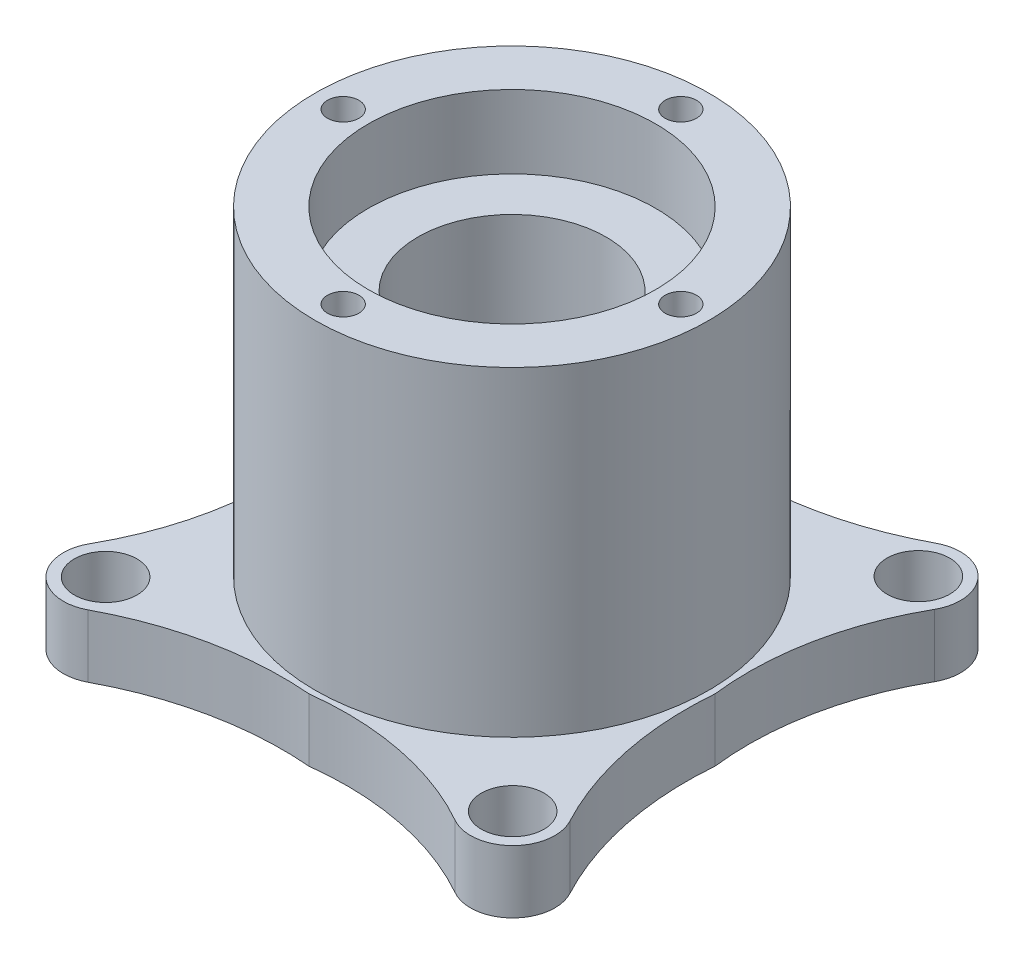
ISO-10303-21;
HEADER;
FILE_DESCRIPTION(('STEP AP214'),'2;1');
FILE_NAME('part.step','',(''),(''),'','','');
FILE_SCHEMA(('AUTOMOTIVE_DESIGN { 1 0 10303 214 1 1 1 1 }'));
ENDSEC;
DATA;
#1=APPLICATION_CONTEXT('core data for automotive mechanical design processes');
#2=APPLICATION_PROTOCOL_DEFINITION('international standard','automotive_design',2000,#1);
#3=PRODUCT_CONTEXT('',#1,'mechanical');
#4=PRODUCT('Part','Part','',(#3));
#5=PRODUCT_RELATED_PRODUCT_CATEGORY('part','',(#4));
#6=PRODUCT_DEFINITION_FORMATION('','',#4);
#7=PRODUCT_DEFINITION_CONTEXT('part definition',#1,'design');
#8=PRODUCT_DEFINITION('design','',#6,#7);
#9=PRODUCT_DEFINITION_SHAPE('','',#8);
#10=(LENGTH_UNIT() NAMED_UNIT(*) SI_UNIT(.MILLI.,.METRE.));
#11=(NAMED_UNIT(*) PLANE_ANGLE_UNIT() SI_UNIT($,.RADIAN.));
#12=(NAMED_UNIT(*) SI_UNIT($,.STERADIAN.) SOLID_ANGLE_UNIT());
#13=UNCERTAINTY_MEASURE_WITH_UNIT(LENGTH_MEASURE(1.E-05),#10,'distance_accuracy_value','');
#14=(GEOMETRIC_REPRESENTATION_CONTEXT(3) GLOBAL_UNCERTAINTY_ASSIGNED_CONTEXT((#13)) GLOBAL_UNIT_ASSIGNED_CONTEXT((#10,
#11,#12)) REPRESENTATION_CONTEXT('',''));
#15=CARTESIAN_POINT('',(0.,0.,0.));
#16=DIRECTION('',(0.,0.,1.));
#17=DIRECTION('',(1.,0.,0.));
#18=AXIS2_PLACEMENT_3D('',#15,#16,#17);
#19=CARTESIAN_POINT('',(-32.3101042343834,10.,-3.38430377971278E-13));
#20=DIRECTION('',(0.,1.,0.));
#21=DIRECTION('',(0.,0.,1.));
#22=AXIS2_PLACEMENT_3D('',#19,#20,#21);
#23=CYLINDRICAL_SURFACE('',#22,3.);
#24=CARTESIAN_POINT('',(-32.3101042343834,50.9999999999996,-3.39286215146385E-13));
#25=DIRECTION('',(0.,-1.,0.));
#26=DIRECTION('',(0.,0.,-1.));
#27=AXIS2_PLACEMENT_3D('',#24,#25,#26);
#28=CIRCLE('',#27,3.);
#29=CARTESIAN_POINT('',(-32.3101042343834,50.9999999999996,-3.00000000000034));
#30=VERTEX_POINT('',#29);
#31=EDGE_CURVE('E239',#30,#30,#28,.T.);
#32=ORIENTED_EDGE('',*,*,#31,.T.);
#33=DIRECTION('',(0.,1.,0.));
#34=VECTOR('',#33,1.);
#35=CARTESIAN_POINT('',(-32.3101042343834,10.,-3.00000000000034));
#36=LINE('',#35,#34);
#37=CARTESIAN_POINT('',(-32.3101042343834,71.2999974279007,-3.00000000000034));
#38=VERTEX_POINT('',#37);
#39=EDGE_CURVE('E237',#30,#38,#36,.T.);
#40=ORIENTED_EDGE('',*,*,#39,.T.);
#41=CARTESIAN_POINT('',(-32.3101042343834,71.2999974279007,-3.38430377971278E-13));
#42=DIRECTION('',(0.,1.,0.));
#43=DIRECTION('',(0.,0.,1.));
#44=AXIS2_PLACEMENT_3D('',#41,#42,#43);
#45=CIRCLE('',#44,3.);
#46=EDGE_CURVE('E241',#38,#38,#45,.T.);
#47=ORIENTED_EDGE('',*,*,#46,.T.);
#48=ORIENTED_EDGE('',*,*,#39,.F.);
#49=EDGE_LOOP('',(#32,#40,#47,#48));
#50=FACE_BOUND('',#49,.T.);
#51=ADVANCED_FACE('F59',(#50),#23,.F.);
#52=CARTESIAN_POINT('',(1.2468466557543E-12,10.,-32.3101042343843));
#53=DIRECTION('',(0.,1.,0.));
#54=DIRECTION('',(0.,0.,1.));
#55=AXIS2_PLACEMENT_3D('',#52,#53,#54);
#56=CYLINDRICAL_SURFACE('',#55,2.99999999999804);
#57=CARTESIAN_POINT('',(1.2468466557543E-12,50.9999999999996,-32.3101042343843));
#58=DIRECTION('',(0.,-1.,0.));
#59=DIRECTION('',(0.,0.,-1.));
#60=AXIS2_PLACEMENT_3D('',#57,#58,#59);
#61=CIRCLE('',#60,2.99999999999799);
#62=CARTESIAN_POINT('',(1.2468466557543E-12,50.9999999999996,-35.3101042343823));
#63=VERTEX_POINT('',#62);
#64=EDGE_CURVE('E492',#63,#63,#61,.T.);
#65=ORIENTED_EDGE('',*,*,#64,.T.);
#66=DIRECTION('',(0.,1.,0.));
#67=VECTOR('',#66,1.);
#68=CARTESIAN_POINT('',(1.24647926171456E-12,10.,-35.3101042343823));
#69=LINE('',#68,#67);
#70=CARTESIAN_POINT('',(1.24721404979404E-12,71.2999974279007,-35.3101042343823));
#71=VERTEX_POINT('',#70);
#72=EDGE_CURVE('E11',#63,#71,#69,.T.);
#73=ORIENTED_EDGE('',*,*,#72,.T.);
#74=CARTESIAN_POINT('',(1.2468466557543E-12,71.2999974279007,-32.3101042343843));
#75=DIRECTION('',(0.,1.,0.));
#76=DIRECTION('',(0.,0.,1.));
#77=AXIS2_PLACEMENT_3D('',#74,#75,#76);
#78=CIRCLE('',#77,2.99999999999804);
#79=EDGE_CURVE('E411',#71,#71,#78,.T.);
#80=ORIENTED_EDGE('',*,*,#79,.T.);
#81=ORIENTED_EDGE('',*,*,#72,.F.);
#82=EDGE_LOOP('',(#65,#73,#80,#81));
#83=FACE_BOUND('',#82,.T.);
#84=ADVANCED_FACE('F61',(#83),#56,.F.);
#85=CARTESIAN_POINT('',(32.3101042343852,10.,3.34473531398203E-13));
#86=DIRECTION('',(0.,1.,0.));
#87=DIRECTION('',(0.,0.,1.));
#88=AXIS2_PLACEMENT_3D('',#85,#86,#87);
#89=CYLINDRICAL_SURFACE('',#88,2.99999999999876);
#90=CARTESIAN_POINT('',(32.3101042343852,50.9999999999996,3.33617694223096E-13));
#91=DIRECTION('',(0.,-1.,0.));
#92=DIRECTION('',(0.,0.,-1.));
#93=AXIS2_PLACEMENT_3D('',#90,#91,#92);
#94=CIRCLE('',#93,2.99999999999875);
#95=CARTESIAN_POINT('',(32.3101042343852,50.9999999999996,-2.99999999999842));
#96=VERTEX_POINT('',#95);
#97=EDGE_CURVE('E489',#96,#96,#94,.T.);
#98=ORIENTED_EDGE('',*,*,#97,.T.);
#99=DIRECTION('',(0.,1.,0.));
#100=VECTOR('',#99,1.);
#101=CARTESIAN_POINT('',(32.3101042343852,10.,-2.99999999999842));
#102=LINE('',#101,#100);
#103=CARTESIAN_POINT('',(32.3101042343852,71.2999974279007,-2.99999999999842));
#104=VERTEX_POINT('',#103);
#105=EDGE_CURVE('E63',#96,#104,#102,.T.);
#106=ORIENTED_EDGE('',*,*,#105,.T.);
#107=CARTESIAN_POINT('',(32.3101042343852,71.2999974279007,3.34473531398203E-13));
#108=DIRECTION('',(0.,1.,0.));
#109=DIRECTION('',(0.,0.,1.));
#110=AXIS2_PLACEMENT_3D('',#107,#108,#109);
#111=CIRCLE('',#110,2.99999999999876);
#112=EDGE_CURVE('E415',#104,#104,#111,.T.);
#113=ORIENTED_EDGE('',*,*,#112,.T.);
#114=ORIENTED_EDGE('',*,*,#105,.F.);
#115=EDGE_LOOP('',(#98,#106,#113,#114));
#116=FACE_BOUND('',#115,.T.);
#117=ADVANCED_FACE('F517',(#116),#89,.F.);
#118=CARTESIAN_POINT('',(5.77899592957895E-13,10.,32.3101042343843));
#119=DIRECTION('',(0.,1.,0.));
#120=DIRECTION('',(0.,0.,1.));
#121=AXIS2_PLACEMENT_3D('',#118,#119,#120);
#122=CYLINDRICAL_SURFACE('',#121,3.);
#123=CARTESIAN_POINT('',(5.77899592957895E-13,50.9999999999996,32.3101042343843));
#124=DIRECTION('',(0.,-1.,0.));
#125=DIRECTION('',(0.,0.,-1.));
#126=AXIS2_PLACEMENT_3D('',#123,#124,#125);
#127=CIRCLE('',#126,3.);
#128=CARTESIAN_POINT('',(5.77899592957895E-13,50.9999999999996,29.3101042343843));
#129=VERTEX_POINT('',#128);
#130=EDGE_CURVE('E486',#129,#129,#127,.T.);
#131=ORIENTED_EDGE('',*,*,#130,.T.);
#132=DIRECTION('',(0.,1.,0.));
#133=VECTOR('',#132,1.);
#134=CARTESIAN_POINT('',(5.77532198918151E-13,10.,29.3101042343843));
#135=LINE('',#134,#133);
#136=CARTESIAN_POINT('',(5.78266986997639E-13,71.2999974279007,29.3101042343843));
#137=VERTEX_POINT('',#136);
#138=EDGE_CURVE('E243',#129,#137,#135,.T.);
#139=ORIENTED_EDGE('',*,*,#138,.T.);
#140=CARTESIAN_POINT('',(5.77899592957895E-13,71.2999974279007,32.3101042343843));
#141=DIRECTION('',(0.,1.,0.));
#142=DIRECTION('',(0.,0.,1.));
#143=AXIS2_PLACEMENT_3D('',#140,#141,#142);
#144=CIRCLE('',#143,3.);
#145=EDGE_CURVE('E410',#137,#137,#144,.T.);
#146=ORIENTED_EDGE('',*,*,#145,.T.);
#147=ORIENTED_EDGE('',*,*,#138,.F.);
#148=EDGE_LOOP('',(#131,#139,#146,#147));
#149=FACE_BOUND('',#148,.T.);
#150=ADVANCED_FACE('F520',(#149),#122,.F.);
#151=CARTESIAN_POINT('',(0.,55.,0.));
#152=DIRECTION('',(0.,-1.,0.));
#153=DIRECTION('',(0.,0.,-1.));
#154=AXIS2_PLACEMENT_3D('',#151,#152,#153);
#155=CYLINDRICAL_SURFACE('',#154,37.6926278172026);
#156=CARTESIAN_POINT('',(0.,10.,0.));
#157=DIRECTION('',(0.,1.,0.));
#158=DIRECTION('',(0.,0.,-1.));
#159=AXIS2_PLACEMENT_3D('',#156,#157,#158);
#160=CIRCLE('',#159,37.6926278172026);
#161=CARTESIAN_POINT('',(0.,10.,37.6926278172026));
#162=VERTEX_POINT('',#161);
#163=EDGE_CURVE('E346',#162,#162,#160,.T.);
#164=ORIENTED_EDGE('',*,*,#163,.T.);
#165=DIRECTION('',(0.,1.,0.));
#166=VECTOR('',#165,1.);
#167=CARTESIAN_POINT('',(0.,55.,37.6926278172026));
#168=LINE('',#167,#166);
#169=CARTESIAN_POINT('',(-1.97619698383278E-13,71.2999974279008,37.6926278172028));
#170=VERTEX_POINT('',#169);
#171=EDGE_CURVE('E80',#162,#170,#168,.T.);
#172=ORIENTED_EDGE('',*,*,#171,.T.);
#173=CARTESIAN_POINT('',(0.,71.2999974279007,0.));
#174=DIRECTION('',(0.,-1.,0.));
#175=DIRECTION('',(0.,0.,-1.));
#176=AXIS2_PLACEMENT_3D('',#173,#174,#175);
#177=CIRCLE('',#176,37.6926278172026);
#178=EDGE_CURVE('E417',#170,#170,#177,.T.);
#179=ORIENTED_EDGE('',*,*,#178,.T.);
#180=ORIENTED_EDGE('',*,*,#171,.F.);
#181=EDGE_LOOP('',(#164,#172,#179,#180));
#182=FACE_BOUND('',#181,.T.);
#183=ADVANCED_FACE('F522',(#182),#155,.T.);
#184=CARTESIAN_POINT('',(-38.9572803572469,10.,-38.8243519864384));
#185=DIRECTION('',(0.,-1.,0.));
#186=DIRECTION('',(0.,0.,-1.));
#187=AXIS2_PLACEMENT_3D('',#184,#185,#186);
#188=CYLINDRICAL_SURFACE('',#187,8.08042077071295);
#189=DIRECTION('',(0.,-1.,0.));
#190=VECTOR('',#189,1.);
#191=CARTESIAN_POINT('',(-46.088241968132,-4.61852778244065E-13,-35.0240116943255));
#192=LINE('',#191,#190);
#193=CARTESIAN_POINT('',(-46.0882419681317,10.,-35.0240116943257));
#194=VERTEX_POINT('',#193);
#195=CARTESIAN_POINT('',(-46.088241968132,-2.00000000000045,-35.0240116943255));
#196=VERTEX_POINT('',#195);
#197=EDGE_CURVE('E295',#194,#196,#192,.T.);
#198=ORIENTED_EDGE('',*,*,#197,.F.);
#199=CARTESIAN_POINT('',(-38.9572803572469,10.,-38.8243519864384));
#200=DIRECTION('',(0.,1.,0.));
#201=DIRECTION('',(0.,0.,-1.));
#202=AXIS2_PLACEMENT_3D('',#199,#200,#201);
#203=CIRCLE('',#202,8.08042077071295);
#204=CARTESIAN_POINT('',(-34.9820962663583,10.,-45.8593439036559));
#205=VERTEX_POINT('',#204);
#206=EDGE_CURVE('E342',#205,#194,#203,.T.);
#207=ORIENTED_EDGE('',*,*,#206,.F.);
#208=DIRECTION('',(0.,-1.,0.));
#209=VECTOR('',#208,1.);
#210=CARTESIAN_POINT('',(-34.9820962663585,-4.2632564145606E-13,-45.8593439036558));
#211=LINE('',#210,#209);
#212=CARTESIAN_POINT('',(-34.9820962663585,-2.00000000000042,-45.8593439036558));
#213=VERTEX_POINT('',#212);
#214=EDGE_CURVE('E89',#205,#213,#211,.T.);
#215=ORIENTED_EDGE('',*,*,#214,.T.);
#216=CARTESIAN_POINT('',(-38.9572803572471,-2.00000000000042,-38.8243519864383));
#217=DIRECTION('',(0.,-1.,0.));
#218=DIRECTION('',(0.,0.,-1.));
#219=AXIS2_PLACEMENT_3D('',#216,#217,#218);
#220=CIRCLE('',#219,8.08042077071295);
#221=EDGE_CURVE('E406',#196,#213,#220,.T.);
#222=ORIENTED_EDGE('',*,*,#221,.F.);
#223=EDGE_LOOP('',(#198,#207,#215,#222));
#224=FACE_BOUND('',#223,.T.);
#225=ADVANCED_FACE('F528',(#224),#188,.T.);
#226=CARTESIAN_POINT('',(-6.84470931965023,10.,-95.654846505766));
#227=DIRECTION('',(0.,-1.,0.));
#228=DIRECTION('',(-0.195910181780839,0.,0.980621843869796));
#229=AXIS2_PLACEMENT_3D('',#226,#227,#228);
#230=CYLINDRICAL_SURFACE('',#229,57.195319944778);
#231=ORIENTED_EDGE('',*,*,#214,.F.);
#232=CARTESIAN_POINT('',(-6.84470931965023,10.,-95.654846505766));
#233=DIRECTION('',(0.,-1.,0.));
#234=DIRECTION('',(0.,0.,1.));
#235=AXIS2_PLACEMENT_3D('',#232,#233,#234);
#236=CIRCLE('',#235,57.195319944778);
#237=CARTESIAN_POINT('',(0.,10.,-38.8705654245107));
#238=VERTEX_POINT('',#237);
#239=EDGE_CURVE('E341',#238,#205,#236,.T.);
#240=ORIENTED_EDGE('',*,*,#239,.F.);
#241=DIRECTION('',(0.,-1.,0.));
#242=VECTOR('',#241,1.);
#243=CARTESIAN_POINT('',(-1.77635683940025E-13,-4.2632564145606E-13,-38.8705654245106));
#244=LINE('',#243,#242);
#245=CARTESIAN_POINT('',(-1.77635683940025E-13,-2.00000000000042,-38.8705654245106));
#246=VERTEX_POINT('',#245);
#247=EDGE_CURVE('E263',#238,#246,#244,.T.);
#248=ORIENTED_EDGE('',*,*,#247,.T.);
#249=CARTESIAN_POINT('',(-6.84470931965054,-2.00000000000042,-95.6548465057659));
#250=DIRECTION('',(0.,1.,0.));
#251=DIRECTION('',(0.,0.,1.));
#252=AXIS2_PLACEMENT_3D('',#249,#250,#251);
#253=CIRCLE('',#252,57.195319944778);
#254=EDGE_CURVE('E402',#213,#246,#253,.T.);
#255=ORIENTED_EDGE('',*,*,#254,.F.);
#256=EDGE_LOOP('',(#231,#240,#248,#255));
#257=FACE_BOUND('',#256,.T.);
#258=ADVANCED_FACE('F619',(#257),#230,.F.);
#259=CARTESIAN_POINT('',(5.25838899789225,10.,-101.940480572363));
#260=DIRECTION('',(0.,-1.,0.));
#261=DIRECTION('',(0.201836698933859,0.,0.979419188582439));
#262=AXIS2_PLACEMENT_3D('',#259,#260,#261);
#263=CYLINDRICAL_SURFACE('',#262,63.2887419025721);
#264=ORIENTED_EDGE('',*,*,#247,.F.);
#265=CARTESIAN_POINT('',(5.25838899789225,10.,-101.940480572363));
#266=DIRECTION('',(0.,-1.,0.));
#267=DIRECTION('',(0.,0.,-1.));
#268=AXIS2_PLACEMENT_3D('',#265,#266,#267);
#269=CIRCLE('',#268,63.2887419025721);
#270=CARTESIAN_POINT('',(35.0240116943257,10.,-46.0882419681319));
#271=VERTEX_POINT('',#270);
#272=EDGE_CURVE('E337',#271,#238,#269,.T.);
#273=ORIENTED_EDGE('',*,*,#272,.F.);
#274=DIRECTION('',(0.,-1.,0.));
#275=VECTOR('',#274,1.);
#276=CARTESIAN_POINT('',(35.0240116943254,-4.61852778244065E-13,-46.0882419681319));
#277=LINE('',#276,#275);
#278=CARTESIAN_POINT('',(35.0240116943254,-2.00000000000045,-46.0882419681319));
#279=VERTEX_POINT('',#278);
#280=EDGE_CURVE('E260',#271,#279,#277,.T.);
#281=ORIENTED_EDGE('',*,*,#280,.T.);
#282=CARTESIAN_POINT('',(5.25838899789191,-2.00000000000042,-101.940480572363));
#283=DIRECTION('',(0.,1.,0.));
#284=DIRECTION('',(0.,0.,-1.));
#285=AXIS2_PLACEMENT_3D('',#282,#283,#284);
#286=CIRCLE('',#285,63.2887419025721);
#287=EDGE_CURVE('E398',#246,#279,#286,.T.);
#288=ORIENTED_EDGE('',*,*,#287,.F.);
#289=EDGE_LOOP('',(#264,#273,#281,#288));
#290=FACE_BOUND('',#289,.T.);
#291=ADVANCED_FACE('F607',(#290),#263,.F.);
#292=CARTESIAN_POINT('',(38.8243519864386,10.,-38.9572803572467));
#293=DIRECTION('',(0.,-1.,0.));
#294=DIRECTION('',(0.,0.,-1.));
#295=AXIS2_PLACEMENT_3D('',#292,#293,#294);
#296=CYLINDRICAL_SURFACE('',#295,8.08042077071295);
#297=ORIENTED_EDGE('',*,*,#280,.F.);
#298=CARTESIAN_POINT('',(38.8243519864386,10.,-38.9572803572467));
#299=DIRECTION('',(0.,1.,0.));
#300=DIRECTION('',(0.,0.,-1.));
#301=AXIS2_PLACEMENT_3D('',#298,#299,#300);
#302=CIRCLE('',#301,8.08042077071295);
#303=CARTESIAN_POINT('',(45.859343903656,10.,-34.9820962663581));
#304=VERTEX_POINT('',#303);
#305=EDGE_CURVE('E333',#304,#271,#302,.T.);
#306=ORIENTED_EDGE('',*,*,#305,.F.);
#307=DIRECTION('',(0.,-1.,0.));
#308=VECTOR('',#307,1.);
#309=CARTESIAN_POINT('',(45.8593439036558,-4.61852778244065E-13,-34.982096266358));
#310=LINE('',#309,#308);
#311=CARTESIAN_POINT('',(45.8593439036558,-2.00000000000045,-34.982096266358));
#312=VERTEX_POINT('',#311);
#313=EDGE_CURVE('E264',#304,#312,#310,.T.);
#314=ORIENTED_EDGE('',*,*,#313,.T.);
#315=CARTESIAN_POINT('',(38.8243519864383,-2.00000000000042,-38.9572803572467));
#316=DIRECTION('',(0.,-1.,0.));
#317=DIRECTION('',(0.,0.,-1.));
#318=AXIS2_PLACEMENT_3D('',#315,#316,#317);
#319=CIRCLE('',#318,8.08042077071295);
#320=EDGE_CURVE('E394',#279,#312,#319,.T.);
#321=ORIENTED_EDGE('',*,*,#320,.F.);
#322=EDGE_LOOP('',(#297,#306,#314,#321));
#323=FACE_BOUND('',#322,.T.);
#324=ADVANCED_FACE('F603',(#323),#296,.T.);
#325=CARTESIAN_POINT('',(95.6548465057661,10.,-6.84470931964989));
#326=DIRECTION('',(0.,-1.,0.));
#327=DIRECTION('',(0.,0.,-1.));
#328=AXIS2_PLACEMENT_3D('',#325,#326,#327);
#329=CYLINDRICAL_SURFACE('',#328,57.195319944778);
#330=ORIENTED_EDGE('',*,*,#313,.F.);
#331=CARTESIAN_POINT('',(95.6548465057661,10.,-6.84470931964989));
#332=DIRECTION('',(0.,-1.,0.));
#333=DIRECTION('',(0.,0.,1.));
#334=AXIS2_PLACEMENT_3D('',#331,#332,#333);
#335=CIRCLE('',#334,57.195319944778);
#336=CARTESIAN_POINT('',(38.8705654245107,10.,0.));
#337=VERTEX_POINT('',#336);
#338=EDGE_CURVE('E329',#337,#304,#335,.T.);
#339=ORIENTED_EDGE('',*,*,#338,.F.);
#340=DIRECTION('',(0.,-1.,0.));
#341=VECTOR('',#340,1.);
#342=CARTESIAN_POINT('',(38.8705654245105,-4.2632564145606E-13,1.06581410364015E-13));
#343=LINE('',#342,#341);
#344=CARTESIAN_POINT('',(38.8705654245105,-2.00000000000042,1.06581410364015E-13));
#345=VERTEX_POINT('',#344);
#346=EDGE_CURVE('E259',#337,#345,#343,.T.);
#347=ORIENTED_EDGE('',*,*,#346,.T.);
#348=CARTESIAN_POINT('',(95.6548465057659,-2.00000000000045,-6.84470931964989));
#349=DIRECTION('',(0.,1.,0.));
#350=DIRECTION('',(0.,0.,1.));
#351=AXIS2_PLACEMENT_3D('',#348,#349,#350);
#352=CIRCLE('',#351,57.195319944778);
#353=EDGE_CURVE('E389',#312,#345,#352,.T.);
#354=ORIENTED_EDGE('',*,*,#353,.F.);
#355=EDGE_LOOP('',(#330,#339,#347,#354));
#356=FACE_BOUND('',#355,.T.);
#357=ADVANCED_FACE('F606',(#356),#329,.F.);
#358=CARTESIAN_POINT('',(101.940480572363,10.,5.25838899789261));
#359=DIRECTION('',(0.,-1.,0.));
#360=DIRECTION('',(0.,0.,-1.));
#361=AXIS2_PLACEMENT_3D('',#358,#359,#360);
#362=CYLINDRICAL_SURFACE('',#361,63.2887419025721);
#363=ORIENTED_EDGE('',*,*,#346,.F.);
#364=CARTESIAN_POINT('',(101.940480572363,10.,5.25838899789261));
#365=DIRECTION('',(0.,-1.,0.));
#366=DIRECTION('',(0.,0.,-1.));
#367=AXIS2_PLACEMENT_3D('',#364,#365,#366);
#368=CIRCLE('',#367,63.2887419025721);
#369=CARTESIAN_POINT('',(46.0882419681318,10.,35.0240116943259));
#370=VERTEX_POINT('',#369);
#371=EDGE_CURVE('E324',#370,#337,#368,.T.);
#372=ORIENTED_EDGE('',*,*,#371,.F.);
#373=DIRECTION('',(0.,-1.,0.));
#374=VECTOR('',#373,1.);
#375=CARTESIAN_POINT('',(46.0882419681317,-4.2632564145606E-13,35.0240116943259));
#376=LINE('',#375,#374);
#377=CARTESIAN_POINT('',(46.0882419681317,-2.00000000000042,35.0240116943259));
#378=VERTEX_POINT('',#377);
#379=EDGE_CURVE('E256',#370,#378,#376,.T.);
#380=ORIENTED_EDGE('',*,*,#379,.T.);
#381=CARTESIAN_POINT('',(101.940480572363,-2.00000000000042,5.25838899789259));
#382=DIRECTION('',(0.,1.,0.));
#383=DIRECTION('',(0.,0.,-1.));
#384=AXIS2_PLACEMENT_3D('',#381,#382,#383);
#385=CIRCLE('',#384,63.2887419025721);
#386=EDGE_CURVE('E383',#345,#378,#385,.T.);
#387=ORIENTED_EDGE('',*,*,#386,.F.);
#388=EDGE_LOOP('',(#363,#372,#380,#387));
#389=FACE_BOUND('',#388,.T.);
#390=ADVANCED_FACE('F596',(#389),#362,.F.);
#391=CARTESIAN_POINT('',(38.9572803572466,10.,38.8243519864387));
#392=DIRECTION('',(0.,-1.,0.));
#393=DIRECTION('',(0.698326101067731,0.,0.715779754231384));
#394=AXIS2_PLACEMENT_3D('',#391,#392,#393);
#395=CYLINDRICAL_SURFACE('',#394,8.08042077071295);
#396=ORIENTED_EDGE('',*,*,#379,.F.);
#397=CARTESIAN_POINT('',(38.9572803572466,10.,38.8243519864387));
#398=DIRECTION('',(0.,1.,0.));
#399=DIRECTION('',(0.,0.,-1.));
#400=AXIS2_PLACEMENT_3D('',#397,#398,#399);
#401=CIRCLE('',#400,8.08042077071295);
#402=CARTESIAN_POINT('',(34.9820962663579,10.,45.8593439036562));
#403=VERTEX_POINT('',#402);
#404=EDGE_CURVE('E320',#403,#370,#401,.T.);
#405=ORIENTED_EDGE('',*,*,#404,.F.);
#406=DIRECTION('',(0.,-1.,0.));
#407=VECTOR('',#406,1.);
#408=CARTESIAN_POINT('',(34.9820962663578,-4.2632564145606E-13,45.8593439036562));
#409=LINE('',#408,#407);
#410=CARTESIAN_POINT('',(34.9820962663578,-2.00000000000042,45.8593439036562));
#411=VERTEX_POINT('',#410);
#412=EDGE_CURVE('E254',#403,#411,#409,.T.);
#413=ORIENTED_EDGE('',*,*,#412,.T.);
#414=CARTESIAN_POINT('',(38.9572803572465,-2.00000000000045,38.8243519864388));
#415=DIRECTION('',(0.,-1.,0.));
#416=DIRECTION('',(0.,0.,-1.));
#417=AXIS2_PLACEMENT_3D('',#414,#415,#416);
#418=CIRCLE('',#417,8.08042077071295);
#419=EDGE_CURVE('E370',#378,#411,#418,.T.);
#420=ORIENTED_EDGE('',*,*,#419,.F.);
#421=EDGE_LOOP('',(#396,#405,#413,#420));
#422=FACE_BOUND('',#421,.T.);
#423=ADVANCED_FACE('F368',(#422),#395,.T.);
#424=CARTESIAN_POINT('',(6.84470931964956,10.,95.6548465057661));
#425=DIRECTION('',(0.,-1.,0.));
#426=DIRECTION('',(0.,0.,-1.));
#427=AXIS2_PLACEMENT_3D('',#424,#425,#426);
#428=CYLINDRICAL_SURFACE('',#427,57.195319944778);
#429=ORIENTED_EDGE('',*,*,#412,.F.);
#430=CARTESIAN_POINT('',(6.84470931964956,10.,95.6548465057661));
#431=DIRECTION('',(0.,-1.,0.));
#432=DIRECTION('',(0.,0.,1.));
#433=AXIS2_PLACEMENT_3D('',#430,#431,#432);
#434=CIRCLE('',#433,57.195319944778);
#435=CARTESIAN_POINT('',(-3.15719672627779E-13,10.,38.8705654245107));
#436=VERTEX_POINT('',#435);
#437=EDGE_CURVE('E325',#436,#403,#434,.T.);
#438=ORIENTED_EDGE('',*,*,#437,.F.);
#439=DIRECTION('',(0.,-1.,0.));
#440=VECTOR('',#439,1.);
#441=CARTESIAN_POINT('',(-4.61852778244065E-13,-4.61852778244065E-13,38.8705654245108));
#442=LINE('',#441,#440);
#443=CARTESIAN_POINT('',(-4.61852778244065E-13,-2.00000000000045,38.8705654245108));
#444=VERTEX_POINT('',#443);
#445=EDGE_CURVE('E355',#436,#444,#442,.T.);
#446=ORIENTED_EDGE('',*,*,#445,.T.);
#447=CARTESIAN_POINT('',(6.84470931964949,-2.00000000000042,95.6548465057662));
#448=DIRECTION('',(0.,1.,0.));
#449=DIRECTION('',(0.,0.,1.));
#450=AXIS2_PLACEMENT_3D('',#447,#448,#449);
#451=CIRCLE('',#450,57.195319944778);
#452=EDGE_CURVE('E374',#411,#444,#451,.T.);
#453=ORIENTED_EDGE('',*,*,#452,.F.);
#454=EDGE_LOOP('',(#429,#438,#446,#453));
#455=FACE_BOUND('',#454,.T.);
#456=ADVANCED_FACE('F375',(#455),#428,.F.);
#457=CARTESIAN_POINT('',(-5.25838899789296,10.,101.940480572363));
#458=DIRECTION('',(0.,-1.,0.));
#459=DIRECTION('',(0.,0.,-1.));
#460=AXIS2_PLACEMENT_3D('',#457,#458,#459);
#461=CYLINDRICAL_SURFACE('',#460,63.2887419025721);
#462=ORIENTED_EDGE('',*,*,#445,.F.);
#463=CARTESIAN_POINT('',(-5.25838899789296,10.,101.940480572363));
#464=DIRECTION('',(0.,-1.,0.));
#465=DIRECTION('',(0.,0.,-1.));
#466=AXIS2_PLACEMENT_3D('',#463,#464,#465);
#467=CIRCLE('',#466,63.2887419025721);
#468=CARTESIAN_POINT('',(-35.024011694326,10.,46.0882419681317));
#469=VERTEX_POINT('',#468);
#470=EDGE_CURVE('E319',#469,#436,#467,.T.);
#471=ORIENTED_EDGE('',*,*,#470,.F.);
#472=DIRECTION('',(0.,-1.,0.));
#473=VECTOR('',#472,1.);
#474=CARTESIAN_POINT('',(-35.0240116943262,-4.2632564145606E-13,46.0882419681319));
#475=LINE('',#474,#473);
#476=CARTESIAN_POINT('',(-35.0240116943262,-2.00000000000042,46.0882419681319));
#477=VERTEX_POINT('',#476);
#478=EDGE_CURVE('E294',#469,#477,#475,.T.);
#479=ORIENTED_EDGE('',*,*,#478,.T.);
#480=CARTESIAN_POINT('',(-5.25838899789305,-2.00000000000045,101.940480572363));
#481=DIRECTION('',(0.,1.,0.));
#482=DIRECTION('',(0.,0.,-1.));
#483=AXIS2_PLACEMENT_3D('',#480,#481,#482);
#484=CIRCLE('',#483,63.2887419025721);
#485=EDGE_CURVE('E280',#444,#477,#484,.T.);
#486=ORIENTED_EDGE('',*,*,#485,.F.);
#487=EDGE_LOOP('',(#462,#471,#479,#486));
#488=FACE_BOUND('',#487,.T.);
#489=ADVANCED_FACE('F554',(#488),#461,.F.);
#490=CARTESIAN_POINT('',(-38.8243519864388,10.,38.9572803572465));
#491=DIRECTION('',(0.,-1.,0.));
#492=DIRECTION('',(-0.715779754231384,0.,0.698326101067732));
#493=AXIS2_PLACEMENT_3D('',#490,#491,#492);
#494=CYLINDRICAL_SURFACE('',#493,8.08042077071295);
#495=ORIENTED_EDGE('',*,*,#478,.F.);
#496=CARTESIAN_POINT('',(-38.8243519864388,10.,38.9572803572465));
#497=DIRECTION('',(0.,1.,0.));
#498=DIRECTION('',(0.,0.,-1.));
#499=AXIS2_PLACEMENT_3D('',#496,#497,#498);
#500=CIRCLE('',#499,8.08042077071295);
#501=CARTESIAN_POINT('',(-45.8593439036563,10.,34.9820962663578));
#502=VERTEX_POINT('',#501);
#503=EDGE_CURVE('E315',#502,#469,#500,.T.);
#504=ORIENTED_EDGE('',*,*,#503,.F.);
#505=DIRECTION('',(0.,-1.,0.));
#506=VECTOR('',#505,1.);
#507=CARTESIAN_POINT('',(-45.8593439036565,-4.2632564145606E-13,34.982096266358));
#508=LINE('',#507,#506);
#509=CARTESIAN_POINT('',(-45.8593439036565,-2.00000000000042,34.982096266358));
#510=VERTEX_POINT('',#509);
#511=EDGE_CURVE('E291',#502,#510,#508,.T.);
#512=ORIENTED_EDGE('',*,*,#511,.T.);
#513=CARTESIAN_POINT('',(-38.824351986439,-2.00000000000045,38.9572803572466));
#514=DIRECTION('',(0.,-1.,0.));
#515=DIRECTION('',(0.,0.,-1.));
#516=AXIS2_PLACEMENT_3D('',#513,#514,#515);
#517=CIRCLE('',#516,8.08042077071295);
#518=EDGE_CURVE('E282',#477,#510,#517,.T.);
#519=ORIENTED_EDGE('',*,*,#518,.F.);
#520=EDGE_LOOP('',(#495,#504,#512,#519));
#521=FACE_BOUND('',#520,.T.);
#522=ADVANCED_FACE('F557',(#521),#494,.T.);
#523=CARTESIAN_POINT('',(-95.6548465057661,10.,6.84470931964923));
#524=DIRECTION('',(0.,-1.,0.));
#525=DIRECTION('',(0.,0.,-1.));
#526=AXIS2_PLACEMENT_3D('',#523,#524,#525);
#527=CYLINDRICAL_SURFACE('',#526,57.195319944778);
#528=ORIENTED_EDGE('',*,*,#511,.F.);
#529=CARTESIAN_POINT('',(-95.6548465057661,10.,6.84470931964923));
#530=DIRECTION('',(0.,-1.,0.));
#531=DIRECTION('',(0.,0.,1.));
#532=AXIS2_PLACEMENT_3D('',#529,#530,#531);
#533=CIRCLE('',#532,57.195319944778);
#534=CARTESIAN_POINT('',(-38.8705654245107,10.,0.));
#535=VERTEX_POINT('',#534);
#536=EDGE_CURVE('E314',#535,#502,#533,.T.);
#537=ORIENTED_EDGE('',*,*,#536,.F.);
#538=DIRECTION('',(0.,-1.,0.));
#539=VECTOR('',#538,1.);
#540=CARTESIAN_POINT('',(-38.8705654245107,10.,0.));
#541=LINE('',#540,#539);
#542=CARTESIAN_POINT('',(-38.8705654245109,-2.00000000000042,1.15463194561016E-13));
#543=VERTEX_POINT('',#542);
#544=EDGE_CURVE('E349',#535,#543,#541,.T.);
#545=ORIENTED_EDGE('',*,*,#544,.T.);
#546=CARTESIAN_POINT('',(-95.6548465057664,-2.00000000000042,6.84470931964945));
#547=DIRECTION('',(0.,1.,0.));
#548=DIRECTION('',(0.,0.,1.));
#549=AXIS2_PLACEMENT_3D('',#546,#547,#548);
#550=CIRCLE('',#549,57.195319944778);
#551=EDGE_CURVE('E286',#510,#543,#550,.T.);
#552=ORIENTED_EDGE('',*,*,#551,.F.);
#553=EDGE_LOOP('',(#528,#537,#545,#552));
#554=FACE_BOUND('',#553,.T.);
#555=ADVANCED_FACE('F576',(#554),#527,.F.);
#556=CARTESIAN_POINT('',(-101.940480572363,10.,-5.25838899789189));
#557=DIRECTION('',(0.,-1.,0.));
#558=DIRECTION('',(0.,0.,-1.));
#559=AXIS2_PLACEMENT_3D('',#556,#557,#558);
#560=CYLINDRICAL_SURFACE('',#559,63.2887419025721);
#561=ORIENTED_EDGE('',*,*,#544,.F.);
#562=CARTESIAN_POINT('',(-101.940480572363,10.,-5.25838899789189));
#563=DIRECTION('',(0.,-1.,0.));
#564=DIRECTION('',(0.,0.,-1.));
#565=AXIS2_PLACEMENT_3D('',#562,#563,#564);
#566=CIRCLE('',#565,63.2887419025721);
#567=EDGE_CURVE('E310',#194,#535,#566,.T.);
#568=ORIENTED_EDGE('',*,*,#567,.F.);
#569=ORIENTED_EDGE('',*,*,#197,.T.);
#570=CARTESIAN_POINT('',(-101.940480572363,-2.00000000000042,-5.25838899789165));
#571=DIRECTION('',(0.,1.,0.));
#572=DIRECTION('',(0.,0.,-1.));
#573=AXIS2_PLACEMENT_3D('',#570,#571,#572);
#574=CIRCLE('',#573,63.2887419025721);
#575=EDGE_CURVE('E431',#543,#196,#574,.T.);
#576=ORIENTED_EDGE('',*,*,#575,.F.);
#577=EDGE_LOOP('',(#561,#568,#569,#576));
#578=FACE_BOUND('',#577,.T.);
#579=ADVANCED_FACE('F567',(#578),#560,.F.);
#580=CARTESIAN_POINT('',(-98.7976635390645,10.,0.793160160878667));
#581=DIRECTION('',(0.,-1.,0.));
#582=DIRECTION('',(0.,0.,-1.));
#583=AXIS2_PLACEMENT_3D('',#580,#581,#582);
#584=PLANE('',#583);
#585=CARTESIAN_POINT('',(38.9572803572465,10.,38.8243519864388));
#586=DIRECTION('',(0.,-1.,0.));
#587=DIRECTION('',(0.,0.,-1.));
#588=AXIS2_PLACEMENT_3D('',#585,#586,#587);
#589=CIRCLE('',#588,5.99999999999999);
#590=CARTESIAN_POINT('',(38.9572803572465,10.,32.8243519864388));
#591=VERTEX_POINT('',#590);
#592=EDGE_CURVE('E447',#591,#591,#589,.T.);
#593=ORIENTED_EDGE('',*,*,#592,.T.);
#594=EDGE_LOOP('',(#593));
#595=FACE_BOUND('',#594,.T.);
#596=CARTESIAN_POINT('',(-38.9572803572471,10.,-38.8243519864383));
#597=DIRECTION('',(0.,-1.,0.));
#598=DIRECTION('',(0.,0.,-1.));
#599=AXIS2_PLACEMENT_3D('',#596,#597,#598);
#600=CIRCLE('',#599,6.);
#601=CARTESIAN_POINT('',(-38.9572803572471,10.,-44.8243519864383));
#602=VERTEX_POINT('',#601);
#603=EDGE_CURVE('E465',#602,#602,#600,.T.);
#604=ORIENTED_EDGE('',*,*,#603,.T.);
#605=EDGE_LOOP('',(#604));
#606=FACE_BOUND('',#605,.T.);
#607=CARTESIAN_POINT('',(38.8243519864383,10.,-38.9572803572467));
#608=DIRECTION('',(0.,-1.,0.));
#609=DIRECTION('',(0.,0.,-1.));
#610=AXIS2_PLACEMENT_3D('',#607,#608,#609);
#611=CIRCLE('',#610,6.);
#612=CARTESIAN_POINT('',(38.8243519864383,10.,-44.9572803572467));
#613=VERTEX_POINT('',#612);
#614=EDGE_CURVE('E468',#613,#613,#611,.T.);
#615=ORIENTED_EDGE('',*,*,#614,.T.);
#616=EDGE_LOOP('',(#615));
#617=FACE_BOUND('',#616,.T.);
#618=CARTESIAN_POINT('',(-38.824351986439,10.,38.9572803572466));
#619=DIRECTION('',(0.,-1.,0.));
#620=DIRECTION('',(0.,0.,-1.));
#621=AXIS2_PLACEMENT_3D('',#618,#619,#620);
#622=CIRCLE('',#621,5.99999999999999);
#623=CARTESIAN_POINT('',(-38.824351986439,10.,32.9572803572466));
#624=VERTEX_POINT('',#623);
#625=EDGE_CURVE('E471',#624,#624,#622,.T.);
#626=ORIENTED_EDGE('',*,*,#625,.T.);
#627=EDGE_LOOP('',(#626));
#628=FACE_BOUND('',#627,.T.);
#629=ORIENTED_EDGE('',*,*,#163,.F.);
#630=EDGE_LOOP('',(#629));
#631=FACE_BOUND('',#630,.T.);
#632=ORIENTED_EDGE('',*,*,#567,.T.);
#633=ORIENTED_EDGE('',*,*,#536,.T.);
#634=ORIENTED_EDGE('',*,*,#503,.T.);
#635=ORIENTED_EDGE('',*,*,#470,.T.);
#636=ORIENTED_EDGE('',*,*,#437,.T.);
#637=ORIENTED_EDGE('',*,*,#404,.T.);
#638=ORIENTED_EDGE('',*,*,#371,.T.);
#639=ORIENTED_EDGE('',*,*,#338,.T.);
#640=ORIENTED_EDGE('',*,*,#305,.T.);
#641=ORIENTED_EDGE('',*,*,#272,.T.);
#642=ORIENTED_EDGE('',*,*,#239,.T.);
#643=ORIENTED_EDGE('',*,*,#206,.T.);
#644=EDGE_LOOP('',(#632,#633,#634,#635,#636,#637,#638,#639,#640,#641,#642,#643));
#645=FACE_BOUND('',#644,.T.);
#646=ADVANCED_FACE('F563',(#595,#606,#617,#628,#631,#645),#584,.F.);
#647=CARTESIAN_POINT('',(0.,55.,0.));
#648=DIRECTION('',(0.,-1.,0.));
#649=DIRECTION('',(0.,0.,-1.));
#650=AXIS2_PLACEMENT_3D('',#647,#648,#649);
#651=CYLINDRICAL_SURFACE('',#650,27.5);
#652=CARTESIAN_POINT('',(0.,71.2999974279007,0.));
#653=DIRECTION('',(0.,1.,0.));
#654=DIRECTION('',(0.,0.,-1.));
#655=AXIS2_PLACEMENT_3D('',#652,#653,#654);
#656=CIRCLE('',#655,27.5);
#657=CARTESIAN_POINT('',(-2.48689957516035E-13,71.2999974279008,27.5));
#658=VERTEX_POINT('',#657);
#659=EDGE_CURVE('E416',#658,#658,#656,.T.);
#660=ORIENTED_EDGE('',*,*,#659,.T.);
#661=DIRECTION('',(0.,-1.,0.));
#662=VECTOR('',#661,1.);
#663=CARTESIAN_POINT('',(0.,55.,27.5));
#664=LINE('',#663,#662);
#665=CARTESIAN_POINT('',(0.,57.2999929830355,27.5));
#666=VERTEX_POINT('',#665);
#667=EDGE_CURVE('E305',#658,#666,#664,.T.);
#668=ORIENTED_EDGE('',*,*,#667,.T.);
#669=CARTESIAN_POINT('',(2.04281036531029E-13,57.2999929830357,-1.82076576038526E-13));
#670=DIRECTION('',(0.,-1.,0.));
#671=DIRECTION('',(0.,0.,-1.));
#672=AXIS2_PLACEMENT_3D('',#669,#670,#671);
#673=CIRCLE('',#672,27.5);
#674=EDGE_CURVE('E435',#666,#666,#673,.T.);
#675=ORIENTED_EDGE('',*,*,#674,.T.);
#676=ORIENTED_EDGE('',*,*,#667,.F.);
#677=EDGE_LOOP('',(#660,#668,#675,#676));
#678=FACE_BOUND('',#677,.T.);
#679=ADVANCED_FACE('F566',(#678),#651,.F.);
#680=CARTESIAN_POINT('',(0.,-2.57209842757788E-06,0.));
#681=DIRECTION('',(0.,1.,0.));
#682=DIRECTION('',(0.348734684865329,0.,0.937221489068555));
#683=AXIS2_PLACEMENT_3D('',#680,#681,#682);
#684=CYLINDRICAL_SURFACE('',#683,23.5);
#685=CARTESIAN_POINT('',(0.,11.0000001355923,0.));
#686=DIRECTION('',(0.,1.,0.));
#687=DIRECTION('',(0.348734684865329,0.,0.937221489068555));
#688=AXIS2_PLACEMENT_3D('',#685,#686,#687);
#689=CIRCLE('',#688,23.5);
#690=CARTESIAN_POINT('',(-8.19526509433527,11.0000001355923,-22.0247049931111));
#691=VERTEX_POINT('',#690);
#692=EDGE_CURVE('E409',#691,#691,#689,.T.);
#693=ORIENTED_EDGE('',*,*,#692,.T.);
#694=DIRECTION('',(0.,-1.,0.));
#695=VECTOR('',#694,1.);
#696=CARTESIAN_POINT('',(-8.19526509433527,-2.57209842456745E-06,-22.0247049931111));
#697=LINE('',#696,#695);
#698=CARTESIAN_POINT('',(-8.19526509433549,-2.00000257209886,-22.024704993111));
#699=VERTEX_POINT('',#698);
#700=EDGE_CURVE('E302',#691,#699,#697,.T.);
#701=ORIENTED_EDGE('',*,*,#700,.T.);
#702=CARTESIAN_POINT('',(-2.30926389122033E-13,-2.00000257209883,0.));
#703=DIRECTION('',(0.,1.,0.));
#704=DIRECTION('',(0.34873468486533,0.,0.937221489068555));
#705=AXIS2_PLACEMENT_3D('',#702,#703,#704);
#706=CIRCLE('',#705,23.5);
#707=EDGE_CURVE('E290',#699,#699,#706,.T.);
#708=ORIENTED_EDGE('',*,*,#707,.F.);
#709=ORIENTED_EDGE('',*,*,#700,.F.);
#710=EDGE_LOOP('',(#693,#701,#708,#709));
#711=FACE_BOUND('',#710,.T.);
#712=ADVANCED_FACE('F584',(#711),#684,.F.);
#713=CARTESIAN_POINT('',(-3.35668348672158E-07,12.0000027076907,2.52457306171294E-07));
#714=DIRECTION('',(0.,1.,0.));
#715=DIRECTION('',(-0.348734684865329,0.,-0.937221489068555));
#716=AXIS2_PLACEMENT_3D('',#713,#714,#715);
#717=CYLINDRICAL_SURFACE('',#716,18.);
#718=CARTESIAN_POINT('',(-3.35668260617392E-07,57.2999929830357,2.52457279598392E-07));
#719=DIRECTION('',(0.,1.,0.));
#720=DIRECTION('',(-0.348734684865329,0.,-0.937221489068555));
#721=AXIS2_PLACEMENT_3D('',#718,#719,#720);
#722=CIRCLE('',#721,18.);
#723=CARTESIAN_POINT('',(6.27722399190791,57.2999929830356,16.8699870556911));
#724=VERTEX_POINT('',#723);
#725=EDGE_CURVE('E420',#724,#724,#722,.T.);
#726=ORIENTED_EDGE('',*,*,#725,.T.);
#727=DIRECTION('',(0.,-1.,0.));
#728=VECTOR('',#727,1.);
#729=CARTESIAN_POINT('',(6.27722399190758,12.0000027076907,16.8699870556913));
#730=LINE('',#729,#728);
#731=CARTESIAN_POINT('',(6.27722399190761,11.0000001355923,16.8699870556913));
#732=VERTEX_POINT('',#731);
#733=EDGE_CURVE('E298',#724,#732,#730,.T.);
#734=ORIENTED_EDGE('',*,*,#733,.T.);
#735=CARTESIAN_POINT('',(-3.35668339790374E-07,11.0000001355923,2.52457272864604E-07));
#736=DIRECTION('',(0.,1.,0.));
#737=DIRECTION('',(-0.34873468486533,0.,-0.937221489068555));
#738=AXIS2_PLACEMENT_3D('',#735,#736,#737);
#739=CIRCLE('',#738,18.);
#740=EDGE_CURVE('E427',#732,#732,#739,.T.);
#741=ORIENTED_EDGE('',*,*,#740,.F.);
#742=ORIENTED_EDGE('',*,*,#733,.F.);
#743=EDGE_LOOP('',(#726,#734,#741,#742));
#744=FACE_BOUND('',#743,.T.);
#745=ADVANCED_FACE('F582',(#744),#717,.F.);
#746=CARTESIAN_POINT('',(-98.7976635390648,-2.00000000000045,0.793160160878887));
#747=DIRECTION('',(0.,-1.,0.));
#748=DIRECTION('',(-1.,0.,0.));
#749=AXIS2_PLACEMENT_3D('',#746,#747,#748);
#750=PLANE('',#749);
#751=CARTESIAN_POINT('',(38.9572803572465,-2.00000000000045,38.8243519864388));
#752=DIRECTION('',(0.,-1.,0.));
#753=DIRECTION('',(0.,0.,-1.));
#754=AXIS2_PLACEMENT_3D('',#751,#752,#753);
#755=CIRCLE('',#754,5.99999999999999);
#756=CARTESIAN_POINT('',(38.9572803572465,-2.00000000000045,32.8243519864388));
#757=VERTEX_POINT('',#756);
#758=EDGE_CURVE('E477',#757,#757,#755,.T.);
#759=ORIENTED_EDGE('',*,*,#758,.F.);
#760=EDGE_LOOP('',(#759));
#761=FACE_BOUND('',#760,.T.);
#762=CARTESIAN_POINT('',(-38.9572803572471,-2.00000000000045,-38.8243519864383));
#763=DIRECTION('',(0.,-1.,0.));
#764=DIRECTION('',(0.,0.,-1.));
#765=AXIS2_PLACEMENT_3D('',#762,#763,#764);
#766=CIRCLE('',#765,6.);
#767=CARTESIAN_POINT('',(-38.9572803572471,-2.00000000000045,-44.8243519864383));
#768=VERTEX_POINT('',#767);
#769=EDGE_CURVE('E478',#768,#768,#766,.T.);
#770=ORIENTED_EDGE('',*,*,#769,.F.);
#771=EDGE_LOOP('',(#770));
#772=FACE_BOUND('',#771,.T.);
#773=CARTESIAN_POINT('',(38.8243519864383,-2.00000000000045,-38.9572803572467));
#774=DIRECTION('',(0.,-1.,0.));
#775=DIRECTION('',(0.,0.,-1.));
#776=AXIS2_PLACEMENT_3D('',#773,#774,#775);
#777=CIRCLE('',#776,6.);
#778=CARTESIAN_POINT('',(38.8243519864383,-2.00000000000045,-44.9572803572467));
#779=VERTEX_POINT('',#778);
#780=EDGE_CURVE('E481',#779,#779,#777,.T.);
#781=ORIENTED_EDGE('',*,*,#780,.F.);
#782=EDGE_LOOP('',(#781));
#783=FACE_BOUND('',#782,.T.);
#784=CARTESIAN_POINT('',(-38.824351986439,-2.00000000000045,38.9572803572466));
#785=DIRECTION('',(0.,-1.,0.));
#786=DIRECTION('',(0.,0.,-1.));
#787=AXIS2_PLACEMENT_3D('',#784,#785,#786);
#788=CIRCLE('',#787,5.99999999999999);
#789=CARTESIAN_POINT('',(-38.824351986439,-2.00000000000045,32.9572803572466));
#790=VERTEX_POINT('',#789);
#791=EDGE_CURVE('E474',#790,#790,#788,.T.);
#792=ORIENTED_EDGE('',*,*,#791,.F.);
#793=EDGE_LOOP('',(#792));
#794=FACE_BOUND('',#793,.T.);
#795=ORIENTED_EDGE('',*,*,#707,.T.);
#796=EDGE_LOOP('',(#795));
#797=FACE_BOUND('',#796,.T.);
#798=ORIENTED_EDGE('',*,*,#575,.T.);
#799=ORIENTED_EDGE('',*,*,#221,.T.);
#800=ORIENTED_EDGE('',*,*,#254,.T.);
#801=ORIENTED_EDGE('',*,*,#287,.T.);
#802=ORIENTED_EDGE('',*,*,#320,.T.);
#803=ORIENTED_EDGE('',*,*,#353,.T.);
#804=ORIENTED_EDGE('',*,*,#386,.T.);
#805=ORIENTED_EDGE('',*,*,#419,.T.);
#806=ORIENTED_EDGE('',*,*,#452,.T.);
#807=ORIENTED_EDGE('',*,*,#485,.T.);
#808=ORIENTED_EDGE('',*,*,#518,.T.);
#809=ORIENTED_EDGE('',*,*,#551,.T.);
#810=EDGE_LOOP('',(#798,#799,#800,#801,#802,#803,#804,#805,#806,#807,#808,#809));
#811=FACE_BOUND('',#810,.T.);
#812=ADVANCED_FACE('F380',(#761,#772,#783,#794,#797,#811),#750,.T.);
#813=CARTESIAN_POINT('',(-3.35668333129036E-07,11.0000001355923,2.52457272864604E-07));
#814=DIRECTION('',(0.,1.,0.));
#815=DIRECTION('',(1.,0.,0.));
#816=AXIS2_PLACEMENT_3D('',#813,#814,#815);
#817=PLANE('',#816);
#818=ORIENTED_EDGE('',*,*,#740,.T.);
#819=EDGE_LOOP('',(#818));
#820=FACE_BOUND('',#819,.T.);
#821=ORIENTED_EDGE('',*,*,#692,.F.);
#822=EDGE_LOOP('',(#821));
#823=FACE_BOUND('',#822,.T.);
#824=ADVANCED_FACE('F571',(#820,#823),#817,.F.);
#825=CARTESIAN_POINT('',(-3.61932706027801E-13,71.2999974279007,1.79856129989275E-13));
#826=DIRECTION('',(0.,1.,0.));
#827=DIRECTION('',(0.,0.,-1.));
#828=AXIS2_PLACEMENT_3D('',#825,#826,#827);
#829=PLANE('',#828);
#830=ORIENTED_EDGE('',*,*,#46,.F.);
#831=EDGE_LOOP('',(#830));
#832=FACE_BOUND('',#831,.T.);
#833=ORIENTED_EDGE('',*,*,#145,.F.);
#834=EDGE_LOOP('',(#833));
#835=FACE_BOUND('',#834,.T.);
#836=ORIENTED_EDGE('',*,*,#112,.F.);
#837=EDGE_LOOP('',(#836));
#838=FACE_BOUND('',#837,.T.);
#839=ORIENTED_EDGE('',*,*,#79,.F.);
#840=EDGE_LOOP('',(#839));
#841=FACE_BOUND('',#840,.T.);
#842=ORIENTED_EDGE('',*,*,#659,.F.);
#843=EDGE_LOOP('',(#842));
#844=FACE_BOUND('',#843,.T.);
#845=ORIENTED_EDGE('',*,*,#178,.F.);
#846=EDGE_LOOP('',(#845));
#847=FACE_BOUND('',#846,.T.);
#848=ADVANCED_FACE('F561',(#832,#835,#838,#841,#844,#847),#829,.T.);
#849=CARTESIAN_POINT('',(-3.35668097761754E-07,57.2999929830357,2.52457068583567E-07));
#850=DIRECTION('',(0.,1.,0.));
#851=DIRECTION('',(0.,0.,-1.));
#852=AXIS2_PLACEMENT_3D('',#849,#850,#851);
#853=PLANE('',#852);
#854=ORIENTED_EDGE('',*,*,#725,.F.);
#855=EDGE_LOOP('',(#854));
#856=FACE_BOUND('',#855,.T.);
#857=ORIENTED_EDGE('',*,*,#674,.F.);
#858=EDGE_LOOP('',(#857));
#859=FACE_BOUND('',#858,.T.);
#860=ADVANCED_FACE('F552',(#856,#859),#853,.T.);
#861=CARTESIAN_POINT('',(-38.824351986439,15.9999999999996,38.9572803572466));
#862=DIRECTION('',(0.,-1.,0.));
#863=DIRECTION('',(0.,0.,-1.));
#864=AXIS2_PLACEMENT_3D('',#861,#862,#863);
#865=CYLINDRICAL_SURFACE('',#864,5.99999999999999);
#866=ORIENTED_EDGE('',*,*,#791,.T.);
#867=EDGE_LOOP('',(#866));
#868=FACE_BOUND('',#867,.T.);
#869=ORIENTED_EDGE('',*,*,#625,.F.);
#870=EDGE_LOOP('',(#869));
#871=FACE_BOUND('',#870,.T.);
#872=ADVANCED_FACE('F544',(#868,#871),#865,.F.);
#873=CARTESIAN_POINT('',(38.8243519864383,15.9999999999996,-38.9572803572467));
#874=DIRECTION('',(0.,-1.,0.));
#875=DIRECTION('',(0.,0.,-1.));
#876=AXIS2_PLACEMENT_3D('',#873,#874,#875);
#877=CYLINDRICAL_SURFACE('',#876,6.);
#878=ORIENTED_EDGE('',*,*,#780,.T.);
#879=EDGE_LOOP('',(#878));
#880=FACE_BOUND('',#879,.T.);
#881=ORIENTED_EDGE('',*,*,#614,.F.);
#882=EDGE_LOOP('',(#881));
#883=FACE_BOUND('',#882,.T.);
#884=ADVANCED_FACE('F542',(#880,#883),#877,.F.);
#885=CARTESIAN_POINT('',(-38.9572803572471,15.9999999999996,-38.8243519864383));
#886=DIRECTION('',(0.,-1.,0.));
#887=DIRECTION('',(0.,0.,-1.));
#888=AXIS2_PLACEMENT_3D('',#885,#886,#887);
#889=CYLINDRICAL_SURFACE('',#888,6.);
#890=ORIENTED_EDGE('',*,*,#769,.T.);
#891=EDGE_LOOP('',(#890));
#892=FACE_BOUND('',#891,.T.);
#893=ORIENTED_EDGE('',*,*,#603,.F.);
#894=EDGE_LOOP('',(#893));
#895=FACE_BOUND('',#894,.T.);
#896=ADVANCED_FACE('F538',(#892,#895),#889,.F.);
#897=CARTESIAN_POINT('',(38.9572803572465,15.9999999999996,38.8243519864388));
#898=DIRECTION('',(0.,-1.,0.));
#899=DIRECTION('',(0.,0.,-1.));
#900=AXIS2_PLACEMENT_3D('',#897,#898,#899);
#901=CYLINDRICAL_SURFACE('',#900,5.99999999999999);
#902=ORIENTED_EDGE('',*,*,#758,.T.);
#903=EDGE_LOOP('',(#902));
#904=FACE_BOUND('',#903,.T.);
#905=ORIENTED_EDGE('',*,*,#592,.F.);
#906=EDGE_LOOP('',(#905));
#907=FACE_BOUND('',#906,.T.);
#908=ADVANCED_FACE('F533',(#904,#907),#901,.F.);
#909=CARTESIAN_POINT('',(5.77899592957895E-13,50.9999999999996,32.3101042343843));
#910=DIRECTION('',(0.,-1.,0.));
#911=DIRECTION('',(0.,0.,-1.));
#912=AXIS2_PLACEMENT_3D('',#909,#910,#911);
#913=PLANE('',#912);
#914=ORIENTED_EDGE('',*,*,#130,.F.);
#915=EDGE_LOOP('',(#914));
#916=FACE_BOUND('',#915,.T.);
#917=ADVANCED_FACE('F509',(#916),#913,.F.);
#918=CARTESIAN_POINT('',(32.3101042343852,50.9999999999996,3.33617694223096E-13));
#919=DIRECTION('',(0.,-1.,0.));
#920=DIRECTION('',(0.,0.,-1.));
#921=AXIS2_PLACEMENT_3D('',#918,#919,#920);
#922=PLANE('',#921);
#923=ORIENTED_EDGE('',*,*,#97,.F.);
#924=EDGE_LOOP('',(#923));
#925=FACE_BOUND('',#924,.T.);
#926=ADVANCED_FACE('F501',(#925),#922,.F.);
#927=CARTESIAN_POINT('',(1.2468466557543E-12,50.9999999999996,-32.3101042343843));
#928=DIRECTION('',(0.,-1.,0.));
#929=DIRECTION('',(0.,0.,-1.));
#930=AXIS2_PLACEMENT_3D('',#927,#928,#929);
#931=PLANE('',#930);
#932=ORIENTED_EDGE('',*,*,#64,.F.);
#933=EDGE_LOOP('',(#932));
#934=FACE_BOUND('',#933,.T.);
#935=ADVANCED_FACE('F498',(#934),#931,.F.);
#936=CARTESIAN_POINT('',(-32.3101042343834,50.9999999999996,-3.39286215146385E-13));
#937=DIRECTION('',(0.,-1.,0.));
#938=DIRECTION('',(0.,0.,-1.));
#939=AXIS2_PLACEMENT_3D('',#936,#937,#938);
#940=PLANE('',#939);
#941=ORIENTED_EDGE('',*,*,#31,.F.);
#942=EDGE_LOOP('',(#941));
#943=FACE_BOUND('',#942,.T.);
#944=ADVANCED_FACE('F500',(#943),#940,.F.);
#945=CLOSED_SHELL('',(#51,#84,#117,#150,#183,#225,#258,#291,#324,#357,#390,#423,#456,#489,#522,
#555,#579,#646,#679,#712,#745,#812,#824,#848,#860,#872,#884,#896,#908,#917,#926,#935,#944));
#946=MANIFOLD_SOLID_BREP('B2',#945);
#947=ADVANCED_BREP_SHAPE_REPRESENTATION('',(#18,#946),#14);
#948=SHAPE_DEFINITION_REPRESENTATION(#9,#947);
ENDSEC;
END-ISO-10303-21;
